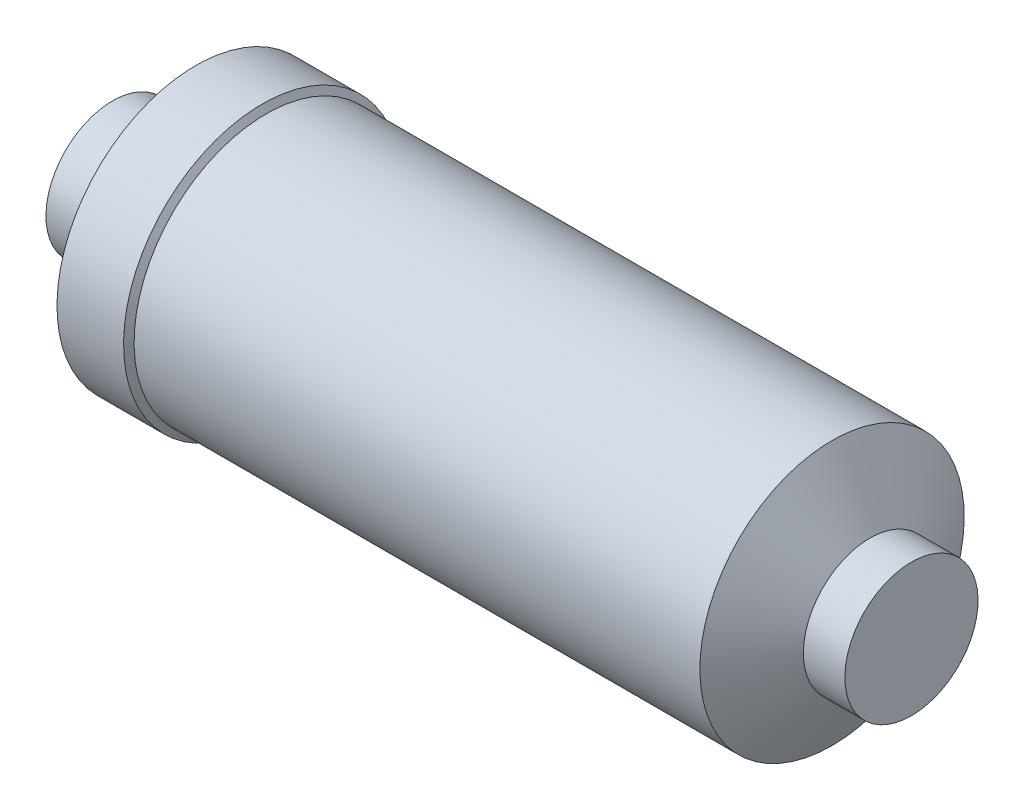
ISO-10303-21;
HEADER;
FILE_DESCRIPTION(('STEP AP214'),'2;1');
FILE_NAME('part.step','',(''),(''),'','','');
FILE_SCHEMA(('AUTOMOTIVE_DESIGN { 1 0 10303 214 1 1 1 1 }'));
ENDSEC;
DATA;
#1=APPLICATION_CONTEXT('core data for automotive mechanical design processes');
#2=APPLICATION_PROTOCOL_DEFINITION('international standard','automotive_design',2000,#1);
#3=PRODUCT_CONTEXT('',#1,'mechanical');
#4=PRODUCT('Part','Part','',(#3));
#5=PRODUCT_RELATED_PRODUCT_CATEGORY('part','',(#4));
#6=PRODUCT_DEFINITION_FORMATION('','',#4);
#7=PRODUCT_DEFINITION_CONTEXT('part definition',#1,'design');
#8=PRODUCT_DEFINITION('design','',#6,#7);
#9=PRODUCT_DEFINITION_SHAPE('','',#8);
#10=(LENGTH_UNIT() NAMED_UNIT(*) SI_UNIT(.MILLI.,.METRE.));
#11=(NAMED_UNIT(*) PLANE_ANGLE_UNIT() SI_UNIT($,.RADIAN.));
#12=(NAMED_UNIT(*) SI_UNIT($,.STERADIAN.) SOLID_ANGLE_UNIT());
#13=UNCERTAINTY_MEASURE_WITH_UNIT(LENGTH_MEASURE(1.E-05),#10,'distance_accuracy_value','');
#14=(GEOMETRIC_REPRESENTATION_CONTEXT(3) GLOBAL_UNCERTAINTY_ASSIGNED_CONTEXT((#13)) GLOBAL_UNIT_ASSIGNED_CONTEXT((#10,
#11,#12)) REPRESENTATION_CONTEXT('',''));
#15=CARTESIAN_POINT('',(0.,0.,0.));
#16=DIRECTION('',(0.,0.,1.));
#17=DIRECTION('',(1.,0.,0.));
#18=AXIS2_PLACEMENT_3D('',#15,#16,#17);
#19=CARTESIAN_POINT('',(-76.2,0.,0.));
#20=DIRECTION('',(1.,0.,0.));
#21=DIRECTION('',(0.,1.,0.));
#22=AXIS2_PLACEMENT_3D('',#19,#20,#21);
#23=PLANE('',#22);
#24=CARTESIAN_POINT('',(-76.2,0.,0.));
#25=DIRECTION('',(-1.,0.,0.));
#26=DIRECTION('',(0.,-1.,0.));
#27=AXIS2_PLACEMENT_3D('',#24,#25,#26);
#28=CIRCLE('',#27,12.7);
#29=CARTESIAN_POINT('',(-76.2,-12.7,0.));
#30=VERTEX_POINT('',#29);
#31=EDGE_CURVE('E10',#30,#30,#28,.T.);
#32=ORIENTED_EDGE('',*,*,#31,.T.);
#33=EDGE_LOOP('',(#32));
#34=FACE_BOUND('',#33,.T.);
#35=ADVANCED_FACE('F41',(#34),#23,.F.);
#36=CARTESIAN_POINT('',(-76.2,0.,0.));
#37=DIRECTION('',(-1.,0.,0.));
#38=DIRECTION('',(0.,-1.,0.));
#39=AXIS2_PLACEMENT_3D('',#36,#37,#38);
#40=CYLINDRICAL_SURFACE('',#39,12.7);
#41=ORIENTED_EDGE('',*,*,#31,.F.);
#42=EDGE_LOOP('',(#41));
#43=FACE_BOUND('',#42,.T.);
#44=CARTESIAN_POINT('',(-68.2752,0.,0.));
#45=DIRECTION('',(-1.,0.,0.));
#46=DIRECTION('',(0.,-1.,0.));
#47=AXIS2_PLACEMENT_3D('',#44,#45,#46);
#48=CIRCLE('',#47,12.7);
#49=CARTESIAN_POINT('',(-68.2752,-12.7,0.));
#50=VERTEX_POINT('',#49);
#51=EDGE_CURVE('E48',#50,#50,#48,.T.);
#52=ORIENTED_EDGE('',*,*,#51,.T.);
#53=EDGE_LOOP('',(#52));
#54=FACE_BOUND('',#53,.T.);
#55=ADVANCED_FACE('F93',(#43,#54),#40,.T.);
#56=CARTESIAN_POINT('',(-60.3196019657016,0.,0.));
#57=DIRECTION('',(1.,0.,0.));
#58=DIRECTION('',(0.,1.,0.));
#59=AXIS2_PLACEMENT_3D('',#56,#57,#58);
#60=CONICAL_SURFACE('',#59,26.4795,1.0471975511966);
#61=ORIENTED_EDGE('',*,*,#51,.F.);
#62=EDGE_LOOP('',(#61));
#63=FACE_BOUND('',#62,.T.);
#64=CARTESIAN_POINT('',(-60.3196019657016,0.,0.));
#65=DIRECTION('',(-1.,0.,0.));
#66=DIRECTION('',(0.,-1.,0.));
#67=AXIS2_PLACEMENT_3D('',#64,#65,#66);
#68=CIRCLE('',#67,26.4795);
#69=CARTESIAN_POINT('',(-60.3196019657016,-26.4795,0.));
#70=VERTEX_POINT('',#69);
#71=EDGE_CURVE('E53',#70,#70,#68,.T.);
#72=ORIENTED_EDGE('',*,*,#71,.T.);
#73=EDGE_LOOP('',(#72));
#74=FACE_BOUND('',#73,.T.);
#75=ADVANCED_FACE('F97',(#63,#74),#60,.T.);
#76=CARTESIAN_POINT('',(-76.2,0.,0.));
#77=DIRECTION('',(-1.,0.,0.));
#78=DIRECTION('',(0.,-1.,0.));
#79=AXIS2_PLACEMENT_3D('',#76,#77,#78);
#80=CYLINDRICAL_SURFACE('',#79,26.4795);
#81=ORIENTED_EDGE('',*,*,#71,.F.);
#82=EDGE_LOOP('',(#81));
#83=FACE_BOUND('',#82,.T.);
#84=CARTESIAN_POINT('',(-47.6196019657016,0.,0.));
#85=DIRECTION('',(-1.,0.,0.));
#86=DIRECTION('',(0.,-1.,0.));
#87=AXIS2_PLACEMENT_3D('',#84,#85,#86);
#88=CIRCLE('',#87,26.4795);
#89=CARTESIAN_POINT('',(-47.6196019657016,-26.4795,0.));
#90=VERTEX_POINT('',#89);
#91=EDGE_CURVE('E58',#90,#90,#88,.T.);
#92=ORIENTED_EDGE('',*,*,#91,.T.);
#93=EDGE_LOOP('',(#92));
#94=FACE_BOUND('',#93,.T.);
#95=ADVANCED_FACE('F102',(#83,#94),#80,.T.);
#96=CARTESIAN_POINT('',(-46.8863671238308,0.,0.));
#97=DIRECTION('',(-1.,0.,0.));
#98=DIRECTION('',(0.,-1.,0.));
#99=AXIS2_PLACEMENT_3D('',#96,#97,#98);
#100=CONICAL_SURFACE('',#99,25.2095,1.0471975511966);
#101=ORIENTED_EDGE('',*,*,#91,.F.);
#102=EDGE_LOOP('',(#101));
#103=FACE_BOUND('',#102,.T.);
#104=CARTESIAN_POINT('',(-46.8863671238308,0.,0.));
#105=DIRECTION('',(-1.,0.,0.));
#106=DIRECTION('',(0.,-1.,0.));
#107=AXIS2_PLACEMENT_3D('',#104,#105,#106);
#108=CIRCLE('',#107,25.2095);
#109=CARTESIAN_POINT('',(-46.8863671238308,-25.2095,0.));
#110=VERTEX_POINT('',#109);
#111=EDGE_CURVE('E64',#110,#110,#108,.T.);
#112=ORIENTED_EDGE('',*,*,#111,.T.);
#113=EDGE_LOOP('',(#112));
#114=FACE_BOUND('',#113,.T.);
#115=ADVANCED_FACE('F108',(#103,#114),#100,.T.);
#116=CARTESIAN_POINT('',(-76.2,0.,0.));
#117=DIRECTION('',(-1.,0.,0.));
#118=DIRECTION('',(0.,-1.,0.));
#119=AXIS2_PLACEMENT_3D('',#116,#117,#118);
#120=CYLINDRICAL_SURFACE('',#119,25.2095);
#121=ORIENTED_EDGE('',*,*,#111,.F.);
#122=EDGE_LOOP('',(#121));
#123=FACE_BOUND('',#122,.T.);
#124=CARTESIAN_POINT('',(61.0528368075724,0.,0.));
#125=DIRECTION('',(-1.,0.,0.));
#126=DIRECTION('',(0.,-1.,0.));
#127=AXIS2_PLACEMENT_3D('',#124,#125,#126);
#128=CIRCLE('',#127,25.2095);
#129=CARTESIAN_POINT('',(61.0528368075724,-25.2095,0.));
#130=VERTEX_POINT('',#129);
#131=EDGE_CURVE('E68',#130,#130,#128,.T.);
#132=ORIENTED_EDGE('',*,*,#131,.T.);
#133=EDGE_LOOP('',(#132));
#134=FACE_BOUND('',#133,.T.);
#135=ADVANCED_FACE('F112',(#123,#134),#120,.T.);
#136=CARTESIAN_POINT('',(68.2752,0.,0.));
#137=DIRECTION('',(-1.,0.,0.));
#138=DIRECTION('',(0.,-1.,0.));
#139=AXIS2_PLACEMENT_3D('',#136,#137,#138);
#140=CONICAL_SURFACE('',#139,12.7,1.0471975511966);
#141=ORIENTED_EDGE('',*,*,#131,.F.);
#142=EDGE_LOOP('',(#141));
#143=FACE_BOUND('',#142,.T.);
#144=CARTESIAN_POINT('',(68.2752,0.,0.));
#145=DIRECTION('',(-1.,0.,0.));
#146=DIRECTION('',(0.,-1.,0.));
#147=AXIS2_PLACEMENT_3D('',#144,#145,#146);
#148=CIRCLE('',#147,12.7);
#149=CARTESIAN_POINT('',(68.2752,-12.6999999999999,0.));
#150=VERTEX_POINT('',#149);
#151=EDGE_CURVE('E72',#150,#150,#148,.T.);
#152=ORIENTED_EDGE('',*,*,#151,.T.);
#153=EDGE_LOOP('',(#152));
#154=FACE_BOUND('',#153,.T.);
#155=ADVANCED_FACE('F89',(#143,#154),#140,.T.);
#156=CARTESIAN_POINT('',(-76.2,0.,0.));
#157=DIRECTION('',(-1.,0.,0.));
#158=DIRECTION('',(0.,-1.,0.));
#159=AXIS2_PLACEMENT_3D('',#156,#157,#158);
#160=CYLINDRICAL_SURFACE('',#159,12.7);
#161=ORIENTED_EDGE('',*,*,#151,.F.);
#162=EDGE_LOOP('',(#161));
#163=FACE_BOUND('',#162,.T.);
#164=CARTESIAN_POINT('',(76.2,0.,0.));
#165=DIRECTION('',(-1.,0.,0.));
#166=DIRECTION('',(0.,-1.,0.));
#167=AXIS2_PLACEMENT_3D('',#164,#165,#166);
#168=CIRCLE('',#167,12.7);
#169=CARTESIAN_POINT('',(76.2,-12.6999999999999,0.));
#170=VERTEX_POINT('',#169);
#171=EDGE_CURVE('E76',#170,#170,#168,.T.);
#172=ORIENTED_EDGE('',*,*,#171,.T.);
#173=EDGE_LOOP('',(#172));
#174=FACE_BOUND('',#173,.T.);
#175=ADVANCED_FACE('F81',(#163,#174),#160,.T.);
#176=CARTESIAN_POINT('',(76.2,12.7,0.));
#177=DIRECTION('',(-1.,0.,0.));
#178=DIRECTION('',(0.,-1.,0.));
#179=AXIS2_PLACEMENT_3D('',#176,#177,#178);
#180=PLANE('',#179);
#181=ORIENTED_EDGE('',*,*,#171,.F.);
#182=EDGE_LOOP('',(#181));
#183=FACE_BOUND('',#182,.T.);
#184=ADVANCED_FACE('F83',(#183),#180,.F.);
#185=CLOSED_SHELL('',(#35,#55,#75,#95,#115,#135,#155,#175,#184));
#186=MANIFOLD_SOLID_BREP('B2',#185);
#187=ADVANCED_BREP_SHAPE_REPRESENTATION('',(#18,#186),#14);
#188=SHAPE_DEFINITION_REPRESENTATION(#9,#187);
ENDSEC;
END-ISO-10303-21;
